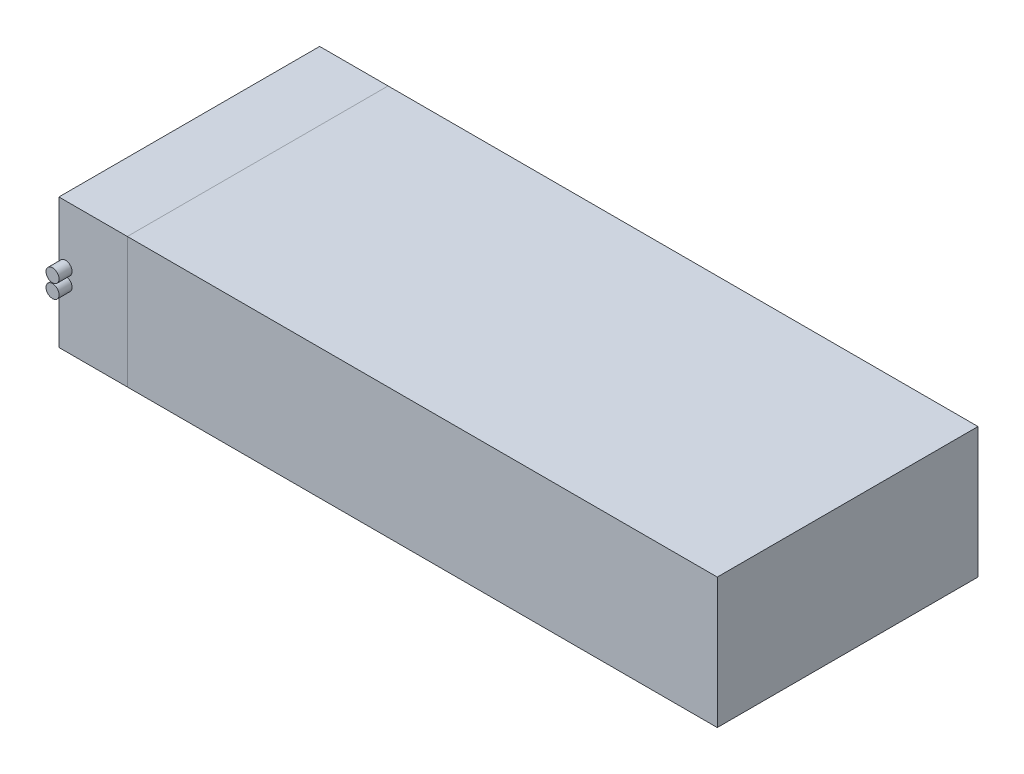
ISO-10303-21;
HEADER;
FILE_DESCRIPTION(('STEP AP214'),'2;1');
FILE_NAME('part.step','',(''),(''),'','','');
FILE_SCHEMA(('AUTOMOTIVE_DESIGN { 1 0 10303 214 1 1 1 1 }'));
ENDSEC;
DATA;
#1=APPLICATION_CONTEXT('core data for automotive mechanical design processes');
#2=APPLICATION_PROTOCOL_DEFINITION('international standard','automotive_design',2000,#1);
#3=PRODUCT_CONTEXT('',#1,'mechanical');
#4=PRODUCT('Part','Part','',(#3));
#5=PRODUCT_RELATED_PRODUCT_CATEGORY('part','',(#4));
#6=PRODUCT_DEFINITION_FORMATION('','',#4);
#7=PRODUCT_DEFINITION_CONTEXT('part definition',#1,'design');
#8=PRODUCT_DEFINITION('design','',#6,#7);
#9=PRODUCT_DEFINITION_SHAPE('','',#8);
#10=(LENGTH_UNIT() NAMED_UNIT(*) SI_UNIT(.MILLI.,.METRE.));
#11=(NAMED_UNIT(*) PLANE_ANGLE_UNIT() SI_UNIT($,.RADIAN.));
#12=(NAMED_UNIT(*) SI_UNIT($,.STERADIAN.) SOLID_ANGLE_UNIT());
#13=UNCERTAINTY_MEASURE_WITH_UNIT(LENGTH_MEASURE(1.E-05),#10,'distance_accuracy_value','');
#14=(GEOMETRIC_REPRESENTATION_CONTEXT(3) GLOBAL_UNCERTAINTY_ASSIGNED_CONTEXT((#13)) GLOBAL_UNIT_ASSIGNED_CONTEXT((#10,
#11,#12)) REPRESENTATION_CONTEXT('',''));
#15=CARTESIAN_POINT('',(0.,0.,0.));
#16=DIRECTION('',(0.,0.,1.));
#17=DIRECTION('',(1.,0.,0.));
#18=AXIS2_PLACEMENT_3D('',#15,#16,#17);
#19=CARTESIAN_POINT('',(0.,10.,0.));
#20=DIRECTION('',(0.,0.,-1.));
#21=DIRECTION('',(-1.,0.,0.));
#22=AXIS2_PLACEMENT_3D('',#19,#20,#21);
#23=PLANE('',#22);
#24=CARTESIAN_POINT('',(0.51,4.5,0.));
#25=DIRECTION('',(0.,0.,-1.));
#26=DIRECTION('',(-1.,0.,0.));
#27=AXIS2_PLACEMENT_3D('',#24,#25,#26);
#28=CIRCLE('',#27,0.5);
#29=CARTESIAN_POINT('',(0.00999999999999959,4.5,0.));
#30=VERTEX_POINT('',#29);
#31=EDGE_CURVE('E11',#30,#30,#28,.F.);
#32=ORIENTED_EDGE('',*,*,#31,.F.);
#33=EDGE_LOOP('',(#32));
#34=FACE_BOUND('',#33,.T.);
#35=CARTESIAN_POINT('',(0.509999999999996,5.55,0.));
#36=DIRECTION('',(0.,0.,-1.));
#37=DIRECTION('',(-1.,0.,0.));
#38=AXIS2_PLACEMENT_3D('',#35,#36,#37);
#39=CIRCLE('',#38,0.5);
#40=CARTESIAN_POINT('',(0.00999999999999612,5.55,0.));
#41=VERTEX_POINT('',#40);
#42=EDGE_CURVE('E58',#41,#41,#39,.F.);
#43=ORIENTED_EDGE('',*,*,#42,.F.);
#44=EDGE_LOOP('',(#43));
#45=FACE_BOUND('',#44,.T.);
#46=DIRECTION('',(0.,-1.,0.));
#47=VECTOR('',#46,1.);
#48=CARTESIAN_POINT('',(5.25,10.,0.));
#49=LINE('',#48,#47);
#50=CARTESIAN_POINT('',(5.25,10.,0.));
#51=VERTEX_POINT('',#50);
#52=CARTESIAN_POINT('',(5.25,0.,0.));
#53=VERTEX_POINT('',#52);
#54=EDGE_CURVE('E65',#51,#53,#49,.T.);
#55=ORIENTED_EDGE('',*,*,#54,.F.);
#56=DIRECTION('',(1.,0.,0.));
#57=VECTOR('',#56,1.);
#58=CARTESIAN_POINT('',(0.,10.,0.));
#59=LINE('',#58,#57);
#60=CARTESIAN_POINT('',(0.,10.,0.));
#61=VERTEX_POINT('',#60);
#62=EDGE_CURVE('E101',#61,#51,#59,.T.);
#63=ORIENTED_EDGE('',*,*,#62,.F.);
#64=DIRECTION('',(0.,-1.,0.));
#65=VECTOR('',#64,1.);
#66=CARTESIAN_POINT('',(0.,10.,0.));
#67=LINE('',#66,#65);
#68=CARTESIAN_POINT('',(0.,0.,0.));
#69=VERTEX_POINT('',#68);
#70=EDGE_CURVE('E104',#61,#69,#67,.T.);
#71=ORIENTED_EDGE('',*,*,#70,.T.);
#72=DIRECTION('',(1.,0.,0.));
#73=VECTOR('',#72,1.);
#74=CARTESIAN_POINT('',(0.,0.,0.));
#75=LINE('',#74,#73);
#76=EDGE_CURVE('E187',#69,#53,#75,.T.);
#77=ORIENTED_EDGE('',*,*,#76,.T.);
#78=EDGE_LOOP('',(#55,#63,#71,#77));
#79=FACE_BOUND('',#78,.T.);
#80=ADVANCED_FACE('F49',(#34,#45,#79),#23,.F.);
#81=CARTESIAN_POINT('',(0.,10.,0.));
#82=DIRECTION('',(0.,-1.,0.));
#83=DIRECTION('',(0.,0.,-1.));
#84=AXIS2_PLACEMENT_3D('',#81,#82,#83);
#85=PLANE('',#84);
#86=DIRECTION('',(0.,0.,1.));
#87=VECTOR('',#86,1.);
#88=CARTESIAN_POINT('',(5.25,10.,0.));
#89=LINE('',#88,#87);
#90=CARTESIAN_POINT('',(5.25,10.,-20.));
#91=VERTEX_POINT('',#90);
#92=EDGE_CURVE('E72',#91,#51,#89,.T.);
#93=ORIENTED_EDGE('',*,*,#92,.F.);
#94=DIRECTION('',(-1.,0.,0.));
#95=VECTOR('',#94,1.);
#96=CARTESIAN_POINT('',(0.,10.,-20.));
#97=LINE('',#96,#95);
#98=CARTESIAN_POINT('',(0.,10.,-20.));
#99=VERTEX_POINT('',#98);
#100=EDGE_CURVE('E114',#91,#99,#97,.T.);
#101=ORIENTED_EDGE('',*,*,#100,.T.);
#102=DIRECTION('',(0.,0.,1.));
#103=VECTOR('',#102,1.);
#104=CARTESIAN_POINT('',(0.,10.,0.));
#105=LINE('',#104,#103);
#106=EDGE_CURVE('E111',#99,#61,#105,.T.);
#107=ORIENTED_EDGE('',*,*,#106,.T.);
#108=ORIENTED_EDGE('',*,*,#62,.T.);
#109=EDGE_LOOP('',(#93,#101,#107,#108));
#110=FACE_BOUND('',#109,.T.);
#111=ADVANCED_FACE('F112',(#110),#85,.F.);
#112=CARTESIAN_POINT('',(0.,10.,-20.));
#113=DIRECTION('',(0.,0.,1.));
#114=DIRECTION('',(1.,0.,0.));
#115=AXIS2_PLACEMENT_3D('',#112,#113,#114);
#116=PLANE('',#115);
#117=DIRECTION('',(0.,1.,0.));
#118=VECTOR('',#117,1.);
#119=CARTESIAN_POINT('',(5.25,10.,-20.));
#120=LINE('',#119,#118);
#121=CARTESIAN_POINT('',(5.25,0.,-20.));
#122=VERTEX_POINT('',#121);
#123=EDGE_CURVE('E130',#122,#91,#120,.T.);
#124=ORIENTED_EDGE('',*,*,#123,.F.);
#125=DIRECTION('',(-1.,0.,0.));
#126=VECTOR('',#125,1.);
#127=CARTESIAN_POINT('',(0.,0.,-20.));
#128=LINE('',#127,#126);
#129=CARTESIAN_POINT('',(0.,0.,-20.));
#130=VERTEX_POINT('',#129);
#131=EDGE_CURVE('E193',#122,#130,#128,.T.);
#132=ORIENTED_EDGE('',*,*,#131,.T.);
#133=DIRECTION('',(0.,-1.,0.));
#134=VECTOR('',#133,1.);
#135=CARTESIAN_POINT('',(0.,10.,-20.));
#136=LINE('',#135,#134);
#137=EDGE_CURVE('E182',#99,#130,#136,.T.);
#138=ORIENTED_EDGE('',*,*,#137,.F.);
#139=ORIENTED_EDGE('',*,*,#100,.F.);
#140=EDGE_LOOP('',(#124,#132,#138,#139));
#141=FACE_BOUND('',#140,.T.);
#142=ADVANCED_FACE('F154',(#141),#116,.F.);
#143=CARTESIAN_POINT('',(0.,0.,0.));
#144=DIRECTION('',(0.,-1.,0.));
#145=DIRECTION('',(0.,0.,-1.));
#146=AXIS2_PLACEMENT_3D('',#143,#144,#145);
#147=PLANE('',#146);
#148=ORIENTED_EDGE('',*,*,#131,.F.);
#149=DIRECTION('',(0.,0.,1.));
#150=VECTOR('',#149,1.);
#151=CARTESIAN_POINT('',(5.25,0.,0.));
#152=LINE('',#151,#150);
#153=EDGE_CURVE('E124',#122,#53,#152,.T.);
#154=ORIENTED_EDGE('',*,*,#153,.T.);
#155=ORIENTED_EDGE('',*,*,#76,.F.);
#156=DIRECTION('',(0.,0.,1.));
#157=VECTOR('',#156,1.);
#158=CARTESIAN_POINT('',(0.,0.,0.));
#159=LINE('',#158,#157);
#160=EDGE_CURVE('E122',#130,#69,#159,.T.);
#161=ORIENTED_EDGE('',*,*,#160,.F.);
#162=EDGE_LOOP('',(#148,#154,#155,#161));
#163=FACE_BOUND('',#162,.T.);
#164=ADVANCED_FACE('F168',(#163),#147,.T.);
#165=CARTESIAN_POINT('',(0.,10.,0.));
#166=DIRECTION('',(1.,0.,0.));
#167=DIRECTION('',(0.,0.,-1.));
#168=AXIS2_PLACEMENT_3D('',#165,#166,#167);
#169=PLANE('',#168);
#170=ORIENTED_EDGE('',*,*,#160,.T.);
#171=ORIENTED_EDGE('',*,*,#70,.F.);
#172=ORIENTED_EDGE('',*,*,#106,.F.);
#173=ORIENTED_EDGE('',*,*,#137,.T.);
#174=EDGE_LOOP('',(#170,#171,#172,#173));
#175=FACE_BOUND('',#174,.T.);
#176=ADVANCED_FACE('F51',(#175),#169,.F.);
#177=CARTESIAN_POINT('',(50.5,10.,0.));
#178=VERTEX_POINT('',#177);
#179=EDGE_CURVE('E108',#51,#178,#59,.T.);
#180=ORIENTED_EDGE('',*,*,#179,.F.);
#181=ORIENTED_EDGE('',*,*,#54,.T.);
#182=CARTESIAN_POINT('',(50.5,0.,0.));
#183=VERTEX_POINT('',#182);
#184=EDGE_CURVE('E185',#53,#183,#75,.T.);
#185=ORIENTED_EDGE('',*,*,#184,.T.);
#186=DIRECTION('',(0.,-1.,0.));
#187=VECTOR('',#186,1.);
#188=CARTESIAN_POINT('',(50.5,10.,0.));
#189=LINE('',#188,#187);
#190=EDGE_CURVE('E125',#178,#183,#189,.T.);
#191=ORIENTED_EDGE('',*,*,#190,.F.);
#192=EDGE_LOOP('',(#180,#181,#185,#191));
#193=FACE_BOUND('',#192,.T.);
#194=ADVANCED_FACE('F150',(#193),#23,.F.);
#195=CARTESIAN_POINT('',(50.5,10.,0.));
#196=DIRECTION('',(-1.,0.,0.));
#197=DIRECTION('',(0.,0.,1.));
#198=AXIS2_PLACEMENT_3D('',#195,#196,#197);
#199=PLANE('',#198);
#200=DIRECTION('',(0.,0.,-1.));
#201=VECTOR('',#200,1.);
#202=CARTESIAN_POINT('',(50.5,0.,0.));
#203=LINE('',#202,#201);
#204=CARTESIAN_POINT('',(50.5,0.,-20.));
#205=VERTEX_POINT('',#204);
#206=EDGE_CURVE('E190',#183,#205,#203,.T.);
#207=ORIENTED_EDGE('',*,*,#206,.T.);
#208=DIRECTION('',(0.,-1.,0.));
#209=VECTOR('',#208,1.);
#210=CARTESIAN_POINT('',(50.5,10.,-20.));
#211=LINE('',#210,#209);
#212=CARTESIAN_POINT('',(50.5,10.,-20.));
#213=VERTEX_POINT('',#212);
#214=EDGE_CURVE('E133',#213,#205,#211,.T.);
#215=ORIENTED_EDGE('',*,*,#214,.F.);
#216=DIRECTION('',(0.,0.,-1.));
#217=VECTOR('',#216,1.);
#218=CARTESIAN_POINT('',(50.5,10.,0.));
#219=LINE('',#218,#217);
#220=EDGE_CURVE('E107',#178,#213,#219,.T.);
#221=ORIENTED_EDGE('',*,*,#220,.F.);
#222=ORIENTED_EDGE('',*,*,#190,.T.);
#223=EDGE_LOOP('',(#207,#215,#221,#222));
#224=FACE_BOUND('',#223,.T.);
#225=ADVANCED_FACE('F160',(#224),#199,.F.);
#226=EDGE_CURVE('E119',#205,#122,#128,.T.);
#227=ORIENTED_EDGE('',*,*,#226,.T.);
#228=ORIENTED_EDGE('',*,*,#123,.T.);
#229=EDGE_CURVE('E178',#213,#91,#97,.T.);
#230=ORIENTED_EDGE('',*,*,#229,.F.);
#231=ORIENTED_EDGE('',*,*,#214,.T.);
#232=EDGE_LOOP('',(#227,#228,#230,#231));
#233=FACE_BOUND('',#232,.T.);
#234=ADVANCED_FACE('F166',(#233),#116,.F.);
#235=ORIENTED_EDGE('',*,*,#229,.T.);
#236=ORIENTED_EDGE('',*,*,#92,.T.);
#237=ORIENTED_EDGE('',*,*,#179,.T.);
#238=ORIENTED_EDGE('',*,*,#220,.T.);
#239=EDGE_LOOP('',(#235,#236,#237,#238));
#240=FACE_BOUND('',#239,.T.);
#241=ADVANCED_FACE('F156',(#240),#85,.F.);
#242=ORIENTED_EDGE('',*,*,#153,.F.);
#243=ORIENTED_EDGE('',*,*,#226,.F.);
#244=ORIENTED_EDGE('',*,*,#206,.F.);
#245=ORIENTED_EDGE('',*,*,#184,.F.);
#246=EDGE_LOOP('',(#242,#243,#244,#245));
#247=FACE_BOUND('',#246,.T.);
#248=ADVANCED_FACE('F207',(#247),#147,.T.);
#249=CARTESIAN_POINT('',(0.509999999999996,5.55,1.));
#250=DIRECTION('',(0.,0.,-1.));
#251=DIRECTION('',(-1.,0.,0.));
#252=AXIS2_PLACEMENT_3D('',#249,#250,#251);
#253=CYLINDRICAL_SURFACE('',#252,0.5);
#254=CARTESIAN_POINT('',(0.509999999999996,5.55,1.));
#255=DIRECTION('',(0.,0.,1.));
#256=DIRECTION('',(1.,0.,0.));
#257=AXIS2_PLACEMENT_3D('',#254,#255,#256);
#258=CIRCLE('',#257,0.5);
#259=CARTESIAN_POINT('',(1.01,5.55,1.));
#260=VERTEX_POINT('',#259);
#261=EDGE_CURVE('E186',#260,#260,#258,.T.);
#262=ORIENTED_EDGE('',*,*,#261,.F.);
#263=EDGE_LOOP('',(#262));
#264=FACE_BOUND('',#263,.T.);
#265=ORIENTED_EDGE('',*,*,#42,.T.);
#266=EDGE_LOOP('',(#265));
#267=FACE_BOUND('',#266,.T.);
#268=ADVANCED_FACE('F146',(#264,#267),#253,.T.);
#269=CARTESIAN_POINT('',(0.,0.,1.));
#270=DIRECTION('',(0.,0.,1.));
#271=DIRECTION('',(1.,0.,0.));
#272=AXIS2_PLACEMENT_3D('',#269,#270,#271);
#273=PLANE('',#272);
#274=ORIENTED_EDGE('',*,*,#261,.T.);
#275=EDGE_LOOP('',(#274));
#276=FACE_BOUND('',#275,.T.);
#277=ADVANCED_FACE('F227',(#276),#273,.T.);
#278=CARTESIAN_POINT('',(0.51,4.5,1.));
#279=DIRECTION('',(0.,0.,-1.));
#280=DIRECTION('',(-1.,0.,0.));
#281=AXIS2_PLACEMENT_3D('',#278,#279,#280);
#282=CYLINDRICAL_SURFACE('',#281,0.5);
#283=CARTESIAN_POINT('',(0.51,4.5,1.));
#284=DIRECTION('',(0.,0.,1.));
#285=DIRECTION('',(1.,0.,0.));
#286=AXIS2_PLACEMENT_3D('',#283,#284,#285);
#287=CIRCLE('',#286,0.5);
#288=CARTESIAN_POINT('',(1.01,4.5,1.));
#289=VERTEX_POINT('',#288);
#290=EDGE_CURVE('E217',#289,#289,#287,.T.);
#291=ORIENTED_EDGE('',*,*,#290,.F.);
#292=EDGE_LOOP('',(#291));
#293=FACE_BOUND('',#292,.T.);
#294=ORIENTED_EDGE('',*,*,#31,.T.);
#295=EDGE_LOOP('',(#294));
#296=FACE_BOUND('',#295,.T.);
#297=ADVANCED_FACE('F224',(#293,#296),#282,.T.);
#298=CARTESIAN_POINT('',(0.,0.,1.));
#299=DIRECTION('',(0.,0.,1.));
#300=DIRECTION('',(1.,0.,0.));
#301=AXIS2_PLACEMENT_3D('',#298,#299,#300);
#302=PLANE('',#301);
#303=ORIENTED_EDGE('',*,*,#290,.T.);
#304=EDGE_LOOP('',(#303));
#305=FACE_BOUND('',#304,.T.);
#306=ADVANCED_FACE('F222',(#305),#302,.T.);
#307=CLOSED_SHELL('',(#80,#111,#142,#164,#176,#194,#225,#234,#241,#248,#268,#277,#297,#306));
#308=MANIFOLD_SOLID_BREP('B2',#307);
#309=ADVANCED_BREP_SHAPE_REPRESENTATION('',(#18,#308),#14);
#310=SHAPE_DEFINITION_REPRESENTATION(#9,#309);
ENDSEC;
END-ISO-10303-21;
